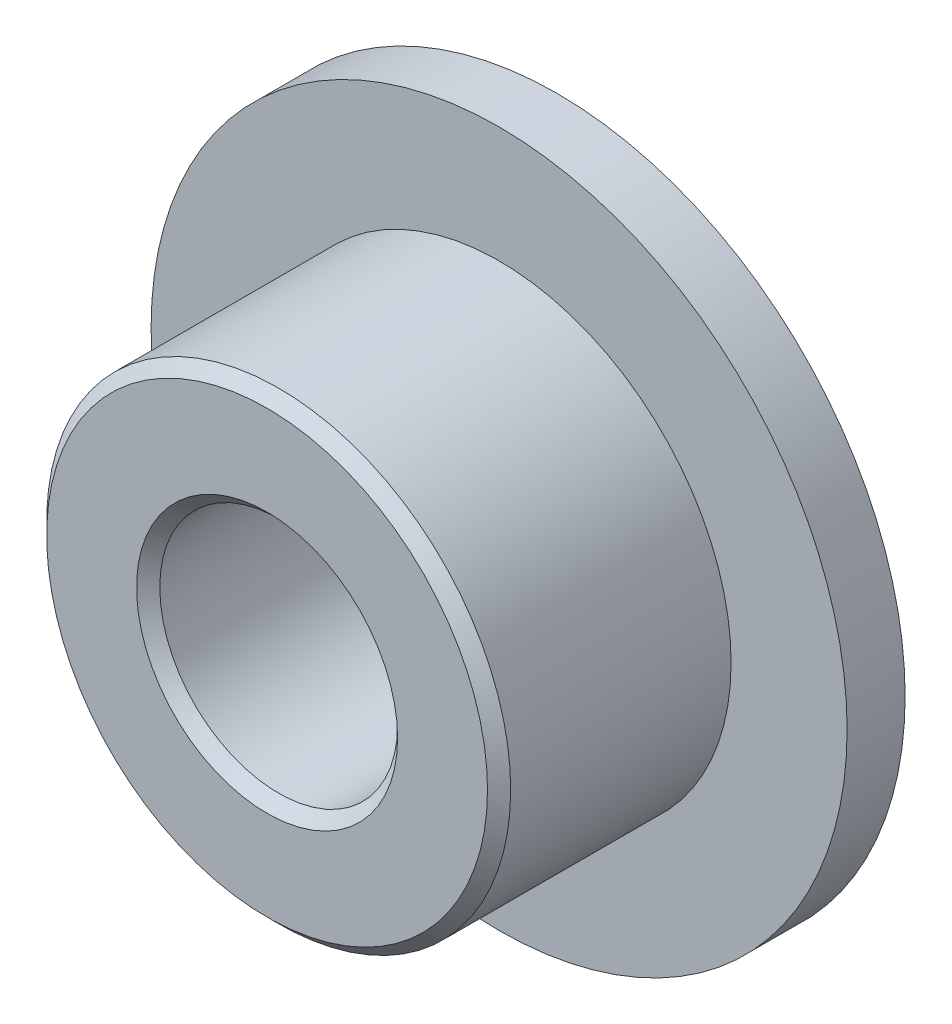
ISO-10303-21;
HEADER;
FILE_DESCRIPTION(('STEP AP214'),'2;1');
FILE_NAME('part.step','',(''),(''),'','','');
FILE_SCHEMA(('AUTOMOTIVE_DESIGN { 1 0 10303 214 1 1 1 1 }'));
ENDSEC;
DATA;
#1=APPLICATION_CONTEXT('core data for automotive mechanical design processes');
#2=APPLICATION_PROTOCOL_DEFINITION('international standard','automotive_design',2000,#1);
#3=PRODUCT_CONTEXT('',#1,'mechanical');
#4=PRODUCT('Part','Part','',(#3));
#5=PRODUCT_RELATED_PRODUCT_CATEGORY('part','',(#4));
#6=PRODUCT_DEFINITION_FORMATION('','',#4);
#7=PRODUCT_DEFINITION_CONTEXT('part definition',#1,'design');
#8=PRODUCT_DEFINITION('design','',#6,#7);
#9=PRODUCT_DEFINITION_SHAPE('','',#8);
#10=(LENGTH_UNIT() NAMED_UNIT(*) SI_UNIT(.MILLI.,.METRE.));
#11=(NAMED_UNIT(*) PLANE_ANGLE_UNIT() SI_UNIT($,.RADIAN.));
#12=(NAMED_UNIT(*) SI_UNIT($,.STERADIAN.) SOLID_ANGLE_UNIT());
#13=UNCERTAINTY_MEASURE_WITH_UNIT(LENGTH_MEASURE(1.E-05),#10,'distance_accuracy_value','');
#14=(GEOMETRIC_REPRESENTATION_CONTEXT(3) GLOBAL_UNCERTAINTY_ASSIGNED_CONTEXT((#13)) GLOBAL_UNIT_ASSIGNED_CONTEXT((#10,
#11,#12)) REPRESENTATION_CONTEXT('',''));
#15=CARTESIAN_POINT('',(0.,0.,0.));
#16=DIRECTION('',(0.,0.,1.));
#17=DIRECTION('',(1.,0.,0.));
#18=AXIS2_PLACEMENT_3D('',#15,#16,#17);
#19=CARTESIAN_POINT('',(0.,0.,1.));
#20=DIRECTION('',(0.,0.,-1.));
#21=DIRECTION('',(-1.,0.,0.));
#22=AXIS2_PLACEMENT_3D('',#19,#20,#21);
#23=CYLINDRICAL_SURFACE('',#22,6.);
#24=CARTESIAN_POINT('',(0.,0.,1.));
#25=DIRECTION('',(0.,0.,1.));
#26=DIRECTION('',(1.,0.,0.));
#27=AXIS2_PLACEMENT_3D('',#24,#25,#26);
#28=CIRCLE('',#27,6.);
#29=CARTESIAN_POINT('',(6.,0.,1.));
#30=VERTEX_POINT('',#29);
#31=EDGE_CURVE('E85',#30,#30,#28,.T.);
#32=ORIENTED_EDGE('',*,*,#31,.F.);
#33=EDGE_LOOP('',(#32));
#34=FACE_BOUND('',#33,.T.);
#35=CARTESIAN_POINT('',(0.,0.,0.));
#36=DIRECTION('',(0.,0.,1.));
#37=DIRECTION('',(1.,0.,0.));
#38=AXIS2_PLACEMENT_3D('',#35,#36,#37);
#39=CIRCLE('',#38,6.);
#40=CARTESIAN_POINT('',(6.,0.,0.));
#41=VERTEX_POINT('',#40);
#42=EDGE_CURVE('E78',#41,#41,#39,.T.);
#43=ORIENTED_EDGE('',*,*,#42,.T.);
#44=EDGE_LOOP('',(#43));
#45=FACE_BOUND('',#44,.T.);
#46=ADVANCED_FACE('F44',(#34,#45),#23,.T.);
#47=CARTESIAN_POINT('',(0.,0.,1.));
#48=DIRECTION('',(0.,0.,1.));
#49=DIRECTION('',(1.,0.,0.));
#50=AXIS2_PLACEMENT_3D('',#47,#48,#49);
#51=PLANE('',#50);
#52=CARTESIAN_POINT('',(0.,0.,1.));
#53=DIRECTION('',(0.,0.,1.));
#54=DIRECTION('',(1.,0.,0.));
#55=AXIS2_PLACEMENT_3D('',#52,#53,#54);
#56=CIRCLE('',#55,4.);
#57=CARTESIAN_POINT('',(4.,0.,1.));
#58=VERTEX_POINT('',#57);
#59=EDGE_CURVE('E80',#58,#58,#56,.T.);
#60=ORIENTED_EDGE('',*,*,#59,.F.);
#61=EDGE_LOOP('',(#60));
#62=FACE_BOUND('',#61,.T.);
#63=ORIENTED_EDGE('',*,*,#31,.T.);
#64=EDGE_LOOP('',(#63));
#65=FACE_BOUND('',#64,.T.);
#66=ADVANCED_FACE('F91',(#62,#65),#51,.T.);
#67=CARTESIAN_POINT('',(0.,0.,0.));
#68=DIRECTION('',(0.,0.,1.));
#69=DIRECTION('',(1.,0.,0.));
#70=AXIS2_PLACEMENT_3D('',#67,#68,#69);
#71=PLANE('',#70);
#72=CARTESIAN_POINT('',(0.,0.,0.));
#73=DIRECTION('',(0.,0.,1.));
#74=DIRECTION('',(1.,0.,0.));
#75=AXIS2_PLACEMENT_3D('',#72,#73,#74);
#76=CIRCLE('',#75,2.25);
#77=CARTESIAN_POINT('',(2.25,0.,0.));
#78=VERTEX_POINT('',#77);
#79=EDGE_CURVE('E74',#78,#78,#76,.T.);
#80=ORIENTED_EDGE('',*,*,#79,.T.);
#81=EDGE_LOOP('',(#80));
#82=FACE_BOUND('',#81,.T.);
#83=ORIENTED_EDGE('',*,*,#42,.F.);
#84=EDGE_LOOP('',(#83));
#85=FACE_BOUND('',#84,.T.);
#86=ADVANCED_FACE('F96',(#82,#85),#71,.F.);
#87=CARTESIAN_POINT('',(0.,0.,5.));
#88=DIRECTION('',(0.,0.,-1.));
#89=DIRECTION('',(-1.,0.,0.));
#90=AXIS2_PLACEMENT_3D('',#87,#88,#89);
#91=CYLINDRICAL_SURFACE('',#90,4.);
#92=CARTESIAN_POINT('',(0.,0.,4.8));
#93=DIRECTION('',(0.,0.,1.));
#94=DIRECTION('',(1.,0.,0.));
#95=AXIS2_PLACEMENT_3D('',#92,#93,#94);
#96=CIRCLE('',#95,4.);
#97=CARTESIAN_POINT('',(4.,0.,4.8));
#98=VERTEX_POINT('',#97);
#99=EDGE_CURVE('E10',#98,#98,#96,.F.);
#100=ORIENTED_EDGE('',*,*,#99,.T.);
#101=EDGE_LOOP('',(#100));
#102=FACE_BOUND('',#101,.T.);
#103=ORIENTED_EDGE('',*,*,#59,.T.);
#104=EDGE_LOOP('',(#103));
#105=FACE_BOUND('',#104,.T.);
#106=ADVANCED_FACE('F93',(#102,#105),#91,.T.);
#107=CARTESIAN_POINT('',(0.,0.,5.));
#108=DIRECTION('',(0.,0.,1.));
#109=DIRECTION('',(1.,0.,0.));
#110=AXIS2_PLACEMENT_3D('',#107,#108,#109);
#111=PLANE('',#110);
#112=CARTESIAN_POINT('',(0.,0.,5.));
#113=DIRECTION('',(0.,0.,1.));
#114=DIRECTION('',(1.,0.,0.));
#115=AXIS2_PLACEMENT_3D('',#112,#113,#114);
#116=CIRCLE('',#115,2.25);
#117=CARTESIAN_POINT('',(2.25,0.,5.));
#118=VERTEX_POINT('',#117);
#119=EDGE_CURVE('E53',#118,#118,#116,.F.);
#120=ORIENTED_EDGE('',*,*,#119,.T.);
#121=EDGE_LOOP('',(#120));
#122=FACE_BOUND('',#121,.T.);
#123=CARTESIAN_POINT('',(0.,0.,5.));
#124=DIRECTION('',(0.,0.,1.));
#125=DIRECTION('',(1.,0.,0.));
#126=AXIS2_PLACEMENT_3D('',#123,#124,#125);
#127=CIRCLE('',#126,3.8);
#128=CARTESIAN_POINT('',(3.8,0.,5.));
#129=VERTEX_POINT('',#128);
#130=EDGE_CURVE('E56',#129,#129,#127,.T.);
#131=ORIENTED_EDGE('',*,*,#130,.T.);
#132=EDGE_LOOP('',(#131));
#133=FACE_BOUND('',#132,.T.);
#134=ADVANCED_FACE('F112',(#122,#133),#111,.T.);
#135=CARTESIAN_POINT('',(0.,0.,0.));
#136=DIRECTION('',(0.,0.,1.));
#137=DIRECTION('',(1.,0.,0.));
#138=AXIS2_PLACEMENT_3D('',#135,#136,#137);
#139=CYLINDRICAL_SURFACE('',#138,2.05);
#140=CARTESIAN_POINT('',(0.,0.,0.200000000000002));
#141=DIRECTION('',(0.,0.,1.));
#142=DIRECTION('',(1.,0.,0.));
#143=AXIS2_PLACEMENT_3D('',#140,#141,#142);
#144=CIRCLE('',#143,2.05);
#145=CARTESIAN_POINT('',(2.05,0.,0.200000000000002));
#146=VERTEX_POINT('',#145);
#147=EDGE_CURVE('E63',#146,#146,#144,.F.);
#148=ORIENTED_EDGE('',*,*,#147,.T.);
#149=EDGE_LOOP('',(#148));
#150=FACE_BOUND('',#149,.T.);
#151=CARTESIAN_POINT('',(0.,0.,4.8));
#152=DIRECTION('',(0.,0.,1.));
#153=DIRECTION('',(1.,0.,0.));
#154=AXIS2_PLACEMENT_3D('',#151,#152,#153);
#155=CIRCLE('',#154,2.05);
#156=CARTESIAN_POINT('',(2.05,0.,4.8));
#157=VERTEX_POINT('',#156);
#158=EDGE_CURVE('E67',#157,#157,#155,.T.);
#159=ORIENTED_EDGE('',*,*,#158,.T.);
#160=EDGE_LOOP('',(#159));
#161=FACE_BOUND('',#160,.T.);
#162=ADVANCED_FACE('F124',(#150,#161),#139,.F.);
#163=CARTESIAN_POINT('',(0.,0.,0.));
#164=DIRECTION('',(0.,0.,-1.));
#165=DIRECTION('',(-1.,0.,0.));
#166=AXIS2_PLACEMENT_3D('',#163,#164,#165);
#167=CONICAL_SURFACE('',#166,2.25,0.785398163397445);
#168=ORIENTED_EDGE('',*,*,#147,.F.);
#169=EDGE_LOOP('',(#168));
#170=FACE_BOUND('',#169,.T.);
#171=ORIENTED_EDGE('',*,*,#79,.F.);
#172=EDGE_LOOP('',(#171));
#173=FACE_BOUND('',#172,.T.);
#174=ADVANCED_FACE('F113',(#170,#173),#167,.F.);
#175=CARTESIAN_POINT('',(0.,0.,4.8));
#176=DIRECTION('',(0.,0.,1.));
#177=DIRECTION('',(1.,0.,0.));
#178=AXIS2_PLACEMENT_3D('',#175,#176,#177);
#179=CONICAL_SURFACE('',#178,2.05,0.785398163397448);
#180=ORIENTED_EDGE('',*,*,#119,.F.);
#181=EDGE_LOOP('',(#180));
#182=FACE_BOUND('',#181,.T.);
#183=ORIENTED_EDGE('',*,*,#158,.F.);
#184=EDGE_LOOP('',(#183));
#185=FACE_BOUND('',#184,.T.);
#186=ADVANCED_FACE('F117',(#182,#185),#179,.F.);
#187=CARTESIAN_POINT('',(0.,0.,5.));
#188=DIRECTION('',(0.,0.,-1.));
#189=DIRECTION('',(-1.,0.,0.));
#190=AXIS2_PLACEMENT_3D('',#187,#188,#189);
#191=CONICAL_SURFACE('',#190,3.8,0.785398163397442);
#192=ORIENTED_EDGE('',*,*,#99,.F.);
#193=EDGE_LOOP('',(#192));
#194=FACE_BOUND('',#193,.T.);
#195=ORIENTED_EDGE('',*,*,#130,.F.);
#196=EDGE_LOOP('',(#195));
#197=FACE_BOUND('',#196,.T.);
#198=ADVANCED_FACE('F48',(#194,#197),#191,.T.);
#199=CLOSED_SHELL('',(#46,#66,#86,#106,#134,#162,#174,#186,#198));
#200=MANIFOLD_SOLID_BREP('B2',#199);
#201=ADVANCED_BREP_SHAPE_REPRESENTATION('',(#18,#200),#14);
#202=SHAPE_DEFINITION_REPRESENTATION(#9,#201);
ENDSEC;
END-ISO-10303-21;
